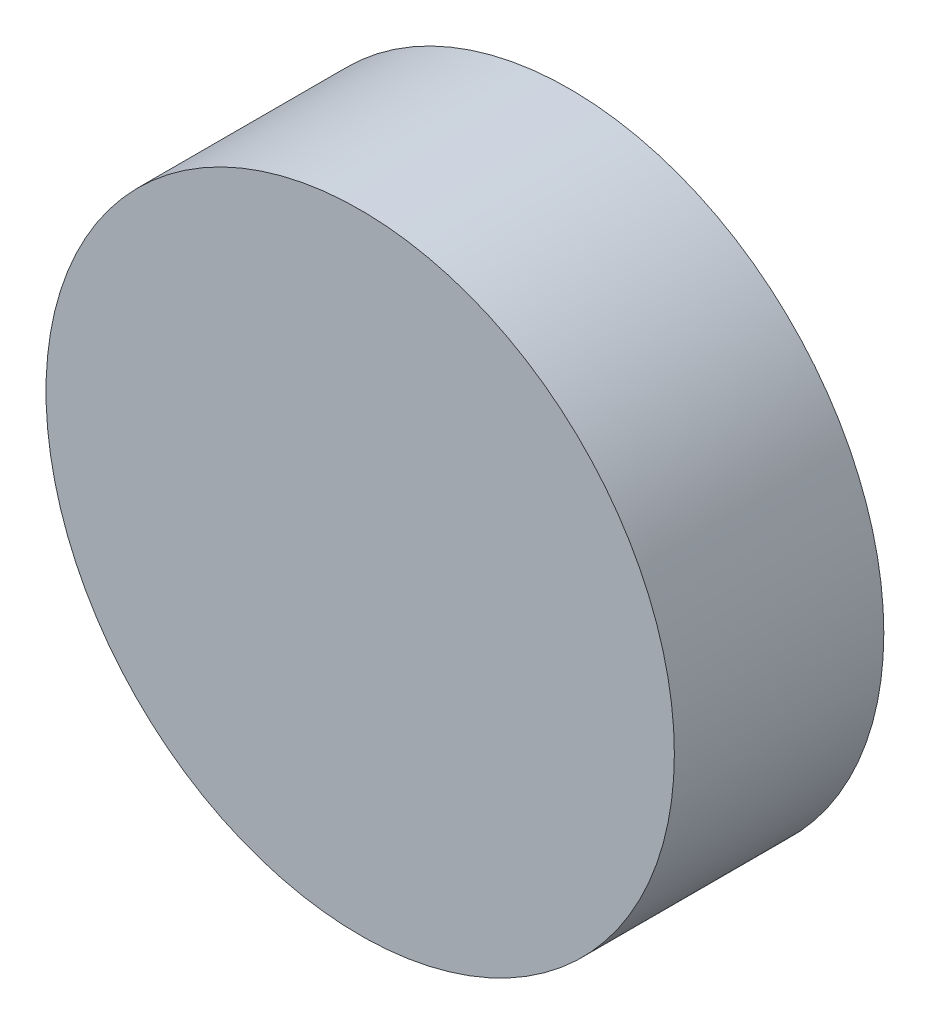
ISO-10303-21;
HEADER;
FILE_DESCRIPTION(('STEP AP214'),'2;1');
FILE_NAME('part.step','',(''),(''),'','','');
FILE_SCHEMA(('AUTOMOTIVE_DESIGN { 1 0 10303 214 1 1 1 1 }'));
ENDSEC;
DATA;
#1=APPLICATION_CONTEXT('core data for automotive mechanical design processes');
#2=APPLICATION_PROTOCOL_DEFINITION('international standard','automotive_design',2000,#1);
#3=PRODUCT_CONTEXT('',#1,'mechanical');
#4=PRODUCT('Part','Part','',(#3));
#5=PRODUCT_RELATED_PRODUCT_CATEGORY('part','',(#4));
#6=PRODUCT_DEFINITION_FORMATION('','',#4);
#7=PRODUCT_DEFINITION_CONTEXT('part definition',#1,'design');
#8=PRODUCT_DEFINITION('design','',#6,#7);
#9=PRODUCT_DEFINITION_SHAPE('','',#8);
#10=(LENGTH_UNIT() NAMED_UNIT(*) SI_UNIT(.MILLI.,.METRE.));
#11=(NAMED_UNIT(*) PLANE_ANGLE_UNIT() SI_UNIT($,.RADIAN.));
#12=(NAMED_UNIT(*) SI_UNIT($,.STERADIAN.) SOLID_ANGLE_UNIT());
#13=UNCERTAINTY_MEASURE_WITH_UNIT(LENGTH_MEASURE(1.E-05),#10,'distance_accuracy_value','');
#14=(GEOMETRIC_REPRESENTATION_CONTEXT(3) GLOBAL_UNCERTAINTY_ASSIGNED_CONTEXT((#13)) GLOBAL_UNIT_ASSIGNED_CONTEXT((#10,
#11,#12)) REPRESENTATION_CONTEXT('',''));
#15=CARTESIAN_POINT('',(0.,0.,0.));
#16=DIRECTION('',(0.,0.,1.));
#17=DIRECTION('',(1.,0.,0.));
#18=AXIS2_PLACEMENT_3D('',#15,#16,#17);
#19=CARTESIAN_POINT('',(0.,0.,1.1));
#20=DIRECTION('',(0.,0.,-1.));
#21=DIRECTION('',(-1.,0.,0.));
#22=AXIS2_PLACEMENT_3D('',#19,#20,#21);
#23=CYLINDRICAL_SURFACE('',#22,1.65);
#24=CARTESIAN_POINT('',(0.,0.,1.1));
#25=DIRECTION('',(0.,0.,1.));
#26=DIRECTION('',(1.,0.,0.));
#27=AXIS2_PLACEMENT_3D('',#24,#25,#26);
#28=CIRCLE('',#27,1.65);
#29=CARTESIAN_POINT('',(1.65,0.,1.1));
#30=VERTEX_POINT('',#29);
#31=EDGE_CURVE('E10',#30,#30,#28,.T.);
#32=ORIENTED_EDGE('',*,*,#31,.F.);
#33=EDGE_LOOP('',(#32));
#34=FACE_BOUND('',#33,.T.);
#35=CARTESIAN_POINT('',(0.,0.,0.));
#36=DIRECTION('',(0.,0.,1.));
#37=DIRECTION('',(1.,0.,0.));
#38=AXIS2_PLACEMENT_3D('',#35,#36,#37);
#39=CIRCLE('',#38,1.65);
#40=CARTESIAN_POINT('',(1.65,0.,0.));
#41=VERTEX_POINT('',#40);
#42=EDGE_CURVE('E40',#41,#41,#39,.T.);
#43=ORIENTED_EDGE('',*,*,#42,.T.);
#44=EDGE_LOOP('',(#43));
#45=FACE_BOUND('',#44,.T.);
#46=ADVANCED_FACE('F37',(#34,#45),#23,.T.);
#47=CARTESIAN_POINT('',(0.,0.,1.1));
#48=DIRECTION('',(0.,0.,1.));
#49=DIRECTION('',(1.,0.,0.));
#50=AXIS2_PLACEMENT_3D('',#47,#48,#49);
#51=PLANE('',#50);
#52=ORIENTED_EDGE('',*,*,#31,.T.);
#53=EDGE_LOOP('',(#52));
#54=FACE_BOUND('',#53,.T.);
#55=ADVANCED_FACE('F52',(#54),#51,.T.);
#56=CARTESIAN_POINT('',(0.,0.,0.));
#57=DIRECTION('',(0.,0.,1.));
#58=DIRECTION('',(1.,0.,0.));
#59=AXIS2_PLACEMENT_3D('',#56,#57,#58);
#60=PLANE('',#59);
#61=ORIENTED_EDGE('',*,*,#42,.F.);
#62=EDGE_LOOP('',(#61));
#63=FACE_BOUND('',#62,.T.);
#64=ADVANCED_FACE('F50',(#63),#60,.F.);
#65=CLOSED_SHELL('',(#46,#55,#64));
#66=MANIFOLD_SOLID_BREP('B2',#65);
#67=ADVANCED_BREP_SHAPE_REPRESENTATION('',(#18,#66),#14);
#68=SHAPE_DEFINITION_REPRESENTATION(#9,#67);
ENDSEC;
END-ISO-10303-21;
